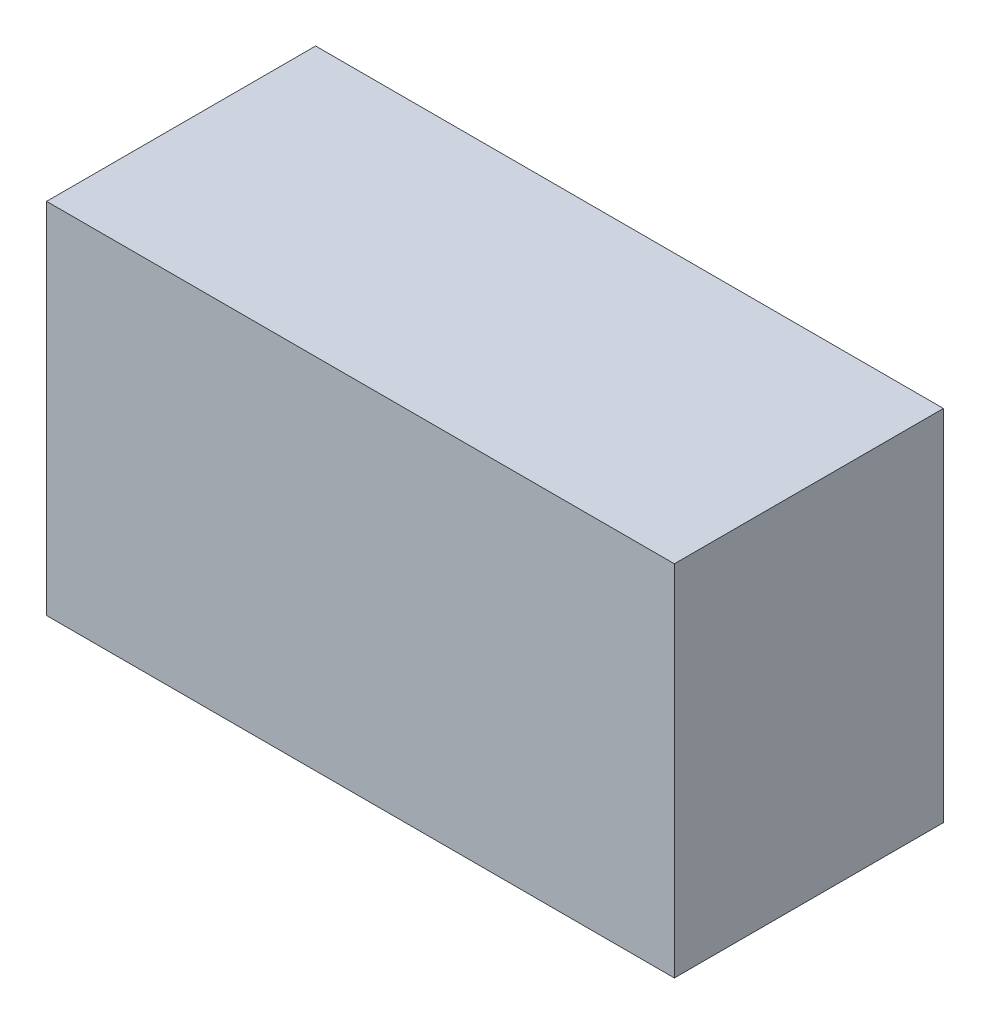
ISO-10303-21;
HEADER;
FILE_DESCRIPTION(('STEP AP214'),'2;1');
FILE_NAME('part.step','',(''),(''),'','','');
FILE_SCHEMA(('AUTOMOTIVE_DESIGN { 1 0 10303 214 1 1 1 1 }'));
ENDSEC;
DATA;
#1=APPLICATION_CONTEXT('core data for automotive mechanical design processes');
#2=APPLICATION_PROTOCOL_DEFINITION('international standard','automotive_design',2000,#1);
#3=PRODUCT_CONTEXT('',#1,'mechanical');
#4=PRODUCT('Part','Part','',(#3));
#5=PRODUCT_RELATED_PRODUCT_CATEGORY('part','',(#4));
#6=PRODUCT_DEFINITION_FORMATION('','',#4);
#7=PRODUCT_DEFINITION_CONTEXT('part definition',#1,'design');
#8=PRODUCT_DEFINITION('design','',#6,#7);
#9=PRODUCT_DEFINITION_SHAPE('','',#8);
#10=(LENGTH_UNIT() NAMED_UNIT(*) SI_UNIT(.MILLI.,.METRE.));
#11=(NAMED_UNIT(*) PLANE_ANGLE_UNIT() SI_UNIT($,.RADIAN.));
#12=(NAMED_UNIT(*) SI_UNIT($,.STERADIAN.) SOLID_ANGLE_UNIT());
#13=UNCERTAINTY_MEASURE_WITH_UNIT(LENGTH_MEASURE(1.E-05),#10,'distance_accuracy_value','');
#14=(GEOMETRIC_REPRESENTATION_CONTEXT(3) GLOBAL_UNCERTAINTY_ASSIGNED_CONTEXT((#13)) GLOBAL_UNIT_ASSIGNED_CONTEXT((#10,
#11,#12)) REPRESENTATION_CONTEXT('',''));
#15=CARTESIAN_POINT('',(0.,0.,0.));
#16=DIRECTION('',(0.,0.,1.));
#17=DIRECTION('',(1.,0.,0.));
#18=AXIS2_PLACEMENT_3D('',#15,#16,#17);
#19=CARTESIAN_POINT('',(0.,0.,3.));
#20=DIRECTION('',(1.,0.,0.));
#21=DIRECTION('',(0.,0.,-1.));
#22=AXIS2_PLACEMENT_3D('',#19,#20,#21);
#23=PLANE('',#22);
#24=DIRECTION('',(0.,-1.,0.));
#25=VECTOR('',#24,1.);
#26=CARTESIAN_POINT('',(0.,0.,0.));
#27=LINE('',#26,#25);
#28=CARTESIAN_POINT('',(0.,4.,0.));
#29=VERTEX_POINT('',#28);
#30=CARTESIAN_POINT('',(0.,0.,0.));
#31=VERTEX_POINT('',#30);
#32=EDGE_CURVE('E107',#29,#31,#27,.T.);
#33=ORIENTED_EDGE('',*,*,#32,.T.);
#34=DIRECTION('',(0.,0.,-1.));
#35=VECTOR('',#34,1.);
#36=CARTESIAN_POINT('',(0.,0.,3.));
#37=LINE('',#36,#35);
#38=CARTESIAN_POINT('',(0.,0.,3.));
#39=VERTEX_POINT('',#38);
#40=EDGE_CURVE('E11',#39,#31,#37,.T.);
#41=ORIENTED_EDGE('',*,*,#40,.F.);
#42=DIRECTION('',(0.,-1.,0.));
#43=VECTOR('',#42,1.);
#44=CARTESIAN_POINT('',(0.,0.,3.));
#45=LINE('',#44,#43);
#46=CARTESIAN_POINT('',(0.,4.,3.));
#47=VERTEX_POINT('',#46);
#48=EDGE_CURVE('E91',#47,#39,#45,.T.);
#49=ORIENTED_EDGE('',*,*,#48,.F.);
#50=DIRECTION('',(0.,0.,-1.));
#51=VECTOR('',#50,1.);
#52=CARTESIAN_POINT('',(0.,4.,3.));
#53=LINE('',#52,#51);
#54=EDGE_CURVE('E103',#47,#29,#53,.T.);
#55=ORIENTED_EDGE('',*,*,#54,.T.);
#56=EDGE_LOOP('',(#33,#41,#49,#55));
#57=FACE_BOUND('',#56,.T.);
#58=ADVANCED_FACE('F39',(#57),#23,.F.);
#59=CARTESIAN_POINT('',(0.,0.,3.));
#60=DIRECTION('',(0.,1.,0.));
#61=DIRECTION('',(0.,0.,1.));
#62=AXIS2_PLACEMENT_3D('',#59,#60,#61);
#63=PLANE('',#62);
#64=DIRECTION('',(1.,0.,0.));
#65=VECTOR('',#64,1.);
#66=CARTESIAN_POINT('',(0.,0.,0.));
#67=LINE('',#66,#65);
#68=CARTESIAN_POINT('',(7.,0.,0.));
#69=VERTEX_POINT('',#68);
#70=EDGE_CURVE('E96',#31,#69,#67,.T.);
#71=ORIENTED_EDGE('',*,*,#70,.T.);
#72=DIRECTION('',(0.,0.,-1.));
#73=VECTOR('',#72,1.);
#74=CARTESIAN_POINT('',(7.,0.,3.));
#75=LINE('',#74,#73);
#76=CARTESIAN_POINT('',(7.,0.,3.));
#77=VERTEX_POINT('',#76);
#78=EDGE_CURVE('E48',#77,#69,#75,.T.);
#79=ORIENTED_EDGE('',*,*,#78,.F.);
#80=DIRECTION('',(1.,0.,0.));
#81=VECTOR('',#80,1.);
#82=CARTESIAN_POINT('',(0.,0.,3.));
#83=LINE('',#82,#81);
#84=EDGE_CURVE('E86',#39,#77,#83,.T.);
#85=ORIENTED_EDGE('',*,*,#84,.F.);
#86=ORIENTED_EDGE('',*,*,#40,.T.);
#87=EDGE_LOOP('',(#71,#79,#85,#86));
#88=FACE_BOUND('',#87,.T.);
#89=ADVANCED_FACE('F95',(#88),#63,.F.);
#90=CARTESIAN_POINT('',(7.,0.,3.));
#91=DIRECTION('',(-1.,0.,0.));
#92=DIRECTION('',(0.,0.,1.));
#93=AXIS2_PLACEMENT_3D('',#90,#91,#92);
#94=PLANE('',#93);
#95=DIRECTION('',(0.,1.,0.));
#96=VECTOR('',#95,1.);
#97=CARTESIAN_POINT('',(7.,0.,0.));
#98=LINE('',#97,#96);
#99=CARTESIAN_POINT('',(7.,4.,0.));
#100=VERTEX_POINT('',#99);
#101=EDGE_CURVE('E73',#69,#100,#98,.T.);
#102=ORIENTED_EDGE('',*,*,#101,.T.);
#103=DIRECTION('',(0.,0.,-1.));
#104=VECTOR('',#103,1.);
#105=CARTESIAN_POINT('',(7.,4.,3.));
#106=LINE('',#105,#104);
#107=CARTESIAN_POINT('',(7.,4.,3.));
#108=VERTEX_POINT('',#107);
#109=EDGE_CURVE('E98',#108,#100,#106,.T.);
#110=ORIENTED_EDGE('',*,*,#109,.F.);
#111=DIRECTION('',(0.,1.,0.));
#112=VECTOR('',#111,1.);
#113=CARTESIAN_POINT('',(7.,0.,3.));
#114=LINE('',#113,#112);
#115=EDGE_CURVE('E89',#77,#108,#114,.T.);
#116=ORIENTED_EDGE('',*,*,#115,.F.);
#117=ORIENTED_EDGE('',*,*,#78,.T.);
#118=EDGE_LOOP('',(#102,#110,#116,#117));
#119=FACE_BOUND('',#118,.T.);
#120=ADVANCED_FACE('F99',(#119),#94,.F.);
#121=CARTESIAN_POINT('',(0.,4.,3.));
#122=DIRECTION('',(0.,-1.,0.));
#123=DIRECTION('',(0.,0.,-1.));
#124=AXIS2_PLACEMENT_3D('',#121,#122,#123);
#125=PLANE('',#124);
#126=DIRECTION('',(-1.,0.,0.));
#127=VECTOR('',#126,1.);
#128=CARTESIAN_POINT('',(0.,4.,0.));
#129=LINE('',#128,#127);
#130=EDGE_CURVE('E79',#100,#29,#129,.T.);
#131=ORIENTED_EDGE('',*,*,#130,.T.);
#132=ORIENTED_EDGE('',*,*,#54,.F.);
#133=DIRECTION('',(-1.,0.,0.));
#134=VECTOR('',#133,1.);
#135=CARTESIAN_POINT('',(0.,4.,3.));
#136=LINE('',#135,#134);
#137=EDGE_CURVE('E56',#108,#47,#136,.T.);
#138=ORIENTED_EDGE('',*,*,#137,.F.);
#139=ORIENTED_EDGE('',*,*,#109,.T.);
#140=EDGE_LOOP('',(#131,#132,#138,#139));
#141=FACE_BOUND('',#140,.T.);
#142=ADVANCED_FACE('F120',(#141),#125,.F.);
#143=CARTESIAN_POINT('',(0.,0.,3.));
#144=DIRECTION('',(0.,0.,-1.));
#145=DIRECTION('',(-1.,0.,0.));
#146=AXIS2_PLACEMENT_3D('',#143,#144,#145);
#147=PLANE('',#146);
#148=ORIENTED_EDGE('',*,*,#48,.T.);
#149=ORIENTED_EDGE('',*,*,#84,.T.);
#150=ORIENTED_EDGE('',*,*,#115,.T.);
#151=ORIENTED_EDGE('',*,*,#137,.T.);
#152=EDGE_LOOP('',(#148,#149,#150,#151));
#153=FACE_BOUND('',#152,.T.);
#154=ADVANCED_FACE('F87',(#153),#147,.F.);
#155=CARTESIAN_POINT('',(0.,0.,0.));
#156=DIRECTION('',(0.,0.,-1.));
#157=DIRECTION('',(-1.,0.,0.));
#158=AXIS2_PLACEMENT_3D('',#155,#156,#157);
#159=PLANE('',#158);
#160=ORIENTED_EDGE('',*,*,#32,.F.);
#161=ORIENTED_EDGE('',*,*,#130,.F.);
#162=ORIENTED_EDGE('',*,*,#101,.F.);
#163=ORIENTED_EDGE('',*,*,#70,.F.);
#164=EDGE_LOOP('',(#160,#161,#162,#163));
#165=FACE_BOUND('',#164,.T.);
#166=ADVANCED_FACE('F123',(#165),#159,.T.);
#167=CLOSED_SHELL('',(#58,#89,#120,#142,#154,#166));
#168=MANIFOLD_SOLID_BREP('B2',#167);
#169=ADVANCED_BREP_SHAPE_REPRESENTATION('',(#18,#168),#14);
#170=SHAPE_DEFINITION_REPRESENTATION(#9,#169);
ENDSEC;
END-ISO-10303-21;
